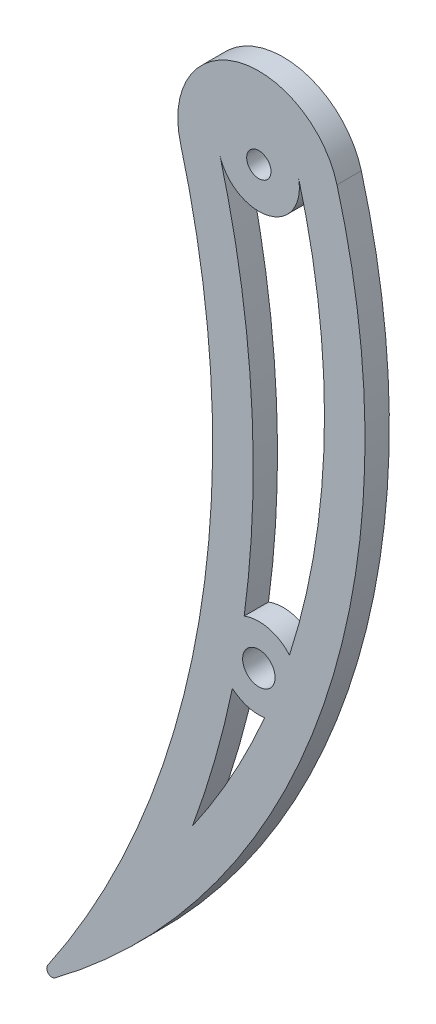
ISO-10303-21;
HEADER;
FILE_DESCRIPTION(('STEP AP214'),'2;1');
FILE_NAME('part.step','',(''),(''),'','','');
FILE_SCHEMA(('AUTOMOTIVE_DESIGN { 1 0 10303 214 1 1 1 1 }'));
ENDSEC;
DATA;
#1=APPLICATION_CONTEXT('core data for automotive mechanical design processes');
#2=APPLICATION_PROTOCOL_DEFINITION('international standard','automotive_design',2000,#1);
#3=PRODUCT_CONTEXT('',#1,'mechanical');
#4=PRODUCT('Part','Part','',(#3));
#5=PRODUCT_RELATED_PRODUCT_CATEGORY('part','',(#4));
#6=PRODUCT_DEFINITION_FORMATION('','',#4);
#7=PRODUCT_DEFINITION_CONTEXT('part definition',#1,'design');
#8=PRODUCT_DEFINITION('design','',#6,#7);
#9=PRODUCT_DEFINITION_SHAPE('','',#8);
#10=(LENGTH_UNIT() NAMED_UNIT(*) SI_UNIT(.MILLI.,.METRE.));
#11=(NAMED_UNIT(*) PLANE_ANGLE_UNIT() SI_UNIT($,.RADIAN.));
#12=(NAMED_UNIT(*) SI_UNIT($,.STERADIAN.) SOLID_ANGLE_UNIT());
#13=UNCERTAINTY_MEASURE_WITH_UNIT(LENGTH_MEASURE(1.E-05),#10,'distance_accuracy_value','');
#14=(GEOMETRIC_REPRESENTATION_CONTEXT(3) GLOBAL_UNCERTAINTY_ASSIGNED_CONTEXT((#13)) GLOBAL_UNIT_ASSIGNED_CONTEXT((#10,
#11,#12)) REPRESENTATION_CONTEXT('',''));
#15=CARTESIAN_POINT('',(0.,0.,0.));
#16=DIRECTION('',(0.,0.,1.));
#17=DIRECTION('',(1.,0.,0.));
#18=AXIS2_PLACEMENT_3D('',#15,#16,#17);
#19=CARTESIAN_POINT('',(-95.2141249078183,-217.941602281109,3.));
#20=DIRECTION('',(0.,0.,1.));
#21=DIRECTION('',(1.,0.,0.));
#22=AXIS2_PLACEMENT_3D('',#19,#20,#21);
#23=PLANE('',#22);
#24=CARTESIAN_POINT('',(-117.212595218132,15.9087079993766,3.));
#25=DIRECTION('',(0.,0.,1.));
#26=DIRECTION('',(1.,0.,0.));
#27=AXIS2_PLACEMENT_3D('',#24,#25,#26);
#28=CIRCLE('',#27,121.658432696751);
#29=CARTESIAN_POINT('',(3.33376281390273,-0.503172192800115,3.));
#30=VERTEX_POINT('',#29);
#31=CARTESIAN_POINT('',(0.314334597053286,47.3442772553386,3.));
#32=VERTEX_POINT('',#31);
#33=EDGE_CURVE('E171',#30,#32,#28,.T.);
#34=ORIENTED_EDGE('',*,*,#33,.T.);
#35=CARTESIAN_POINT('',(5.1445353159848,48.6362373997833,3.));
#36=DIRECTION('',(0.,0.,1.));
#37=DIRECTION('',(1.,0.,0.));
#38=AXIS2_PLACEMENT_3D('',#35,#36,#37);
#39=CIRCLE('',#38,5.00000000000001);
#40=CARTESIAN_POINT('',(9.96421089902344,49.9669241676822,3.));
#41=VERTEX_POINT('',#40);
#42=EDGE_CURVE('E174',#32,#41,#39,.T.);
#43=ORIENTED_EDGE('',*,*,#42,.T.);
#44=CARTESIAN_POINT('',(-77.6238192724142,25.7843353673839,3.));
#45=DIRECTION('',(0.,0.,1.));
#46=DIRECTION('',(1.,0.,0.));
#47=AXIS2_PLACEMENT_3D('',#44,#45,#46);
#48=CIRCLE('',#47,90.8650682627652);
#49=CARTESIAN_POINT('',(8.92421485570226,-1.89053444180164,3.));
#50=VERTEX_POINT('',#49);
#51=EDGE_CURVE('E160',#50,#41,#48,.T.);
#52=ORIENTED_EDGE('',*,*,#51,.F.);
#53=CARTESIAN_POINT('',(5.1445353159848,-5.16376260021669,3.));
#54=DIRECTION('',(0.,0.,1.));
#55=DIRECTION('',(1.,0.,0.));
#56=AXIS2_PLACEMENT_3D('',#53,#54,#55);
#57=CIRCLE('',#56,5.);
#58=EDGE_CURVE('E168',#50,#30,#57,.T.);
#59=ORIENTED_EDGE('',*,*,#58,.T.);
#60=EDGE_LOOP('',(#34,#43,#52,#59));
#61=FACE_BOUND('',#60,.T.);
#62=CARTESIAN_POINT('',(5.1445353159848,48.6362373997833,3.));
#63=DIRECTION('',(0.,0.,1.));
#64=DIRECTION('',(1.,0.,0.));
#65=AXIS2_PLACEMENT_3D('',#62,#63,#64);
#66=CIRCLE('',#65,1.5);
#67=CARTESIAN_POINT('',(6.6445353159848,48.6362373997833,3.));
#68=VERTEX_POINT('',#67);
#69=EDGE_CURVE('E12',#68,#68,#66,.T.);
#70=ORIENTED_EDGE('',*,*,#69,.F.);
#71=EDGE_LOOP('',(#70));
#72=FACE_BOUND('',#71,.T.);
#73=CARTESIAN_POINT('',(5.1445353159848,-5.16376260021669,3.));
#74=DIRECTION('',(0.,0.,1.));
#75=DIRECTION('',(1.,0.,0.));
#76=AXIS2_PLACEMENT_3D('',#73,#74,#75);
#77=CIRCLE('',#76,2.);
#78=CARTESIAN_POINT('',(7.1445353159848,-5.16376260021669,3.));
#79=VERTEX_POINT('',#78);
#80=EDGE_CURVE('E42',#79,#79,#77,.T.);
#81=ORIENTED_EDGE('',*,*,#80,.F.);
#82=EDGE_LOOP('',(#81));
#83=FACE_BOUND('',#82,.T.);
#84=CARTESIAN_POINT('',(5.1445353159848,48.6362373997833,3.));
#85=DIRECTION('',(0.,0.,-1.));
#86=DIRECTION('',(-1.,0.,0.));
#87=AXIS2_PLACEMENT_3D('',#84,#85,#86);
#88=CIRCLE('',#87,10.);
#89=CARTESIAN_POINT('',(-4.51586612187821,46.0523171108939,3.));
#90=VERTEX_POINT('',#89);
#91=CARTESIAN_POINT('',(14.7838864820621,51.2976109355811,3.));
#92=VERTEX_POINT('',#91);
#93=EDGE_CURVE('E184',#90,#92,#88,.T.);
#94=ORIENTED_EDGE('',*,*,#93,.F.);
#95=CARTESIAN_POINT('',(-117.212595218132,15.9087079993766,3.));
#96=DIRECTION('',(0.,0.,1.));
#97=DIRECTION('',(1.,0.,0.));
#98=AXIS2_PLACEMENT_3D('',#95,#96,#97);
#99=CIRCLE('',#98,116.658432696751);
#100=CARTESIAN_POINT('',(-20.9096081362863,-49.93143627732,3.));
#101=VERTEX_POINT('',#100);
#102=EDGE_CURVE('E206',#90,#101,#99,.F.);
#103=ORIENTED_EDGE('',*,*,#102,.T.);
#104=CARTESIAN_POINT('',(-20.373713949507,-50.2978148460824,3.));
#105=DIRECTION('',(0.,0.,-1.));
#106=DIRECTION('',(-1.,0.,0.));
#107=AXIS2_PLACEMENT_3D('',#104,#105,#106);
#108=CIRCLE('',#107,0.649165491282673);
#109=CARTESIAN_POINT('',(-19.9833926726387,-50.8165297349146,3.));
#110=VERTEX_POINT('',#109);
#111=EDGE_CURVE('E178',#110,#101,#108,.T.);
#112=ORIENTED_EDGE('',*,*,#111,.F.);
#113=CARTESIAN_POINT('',(-77.6238192724142,25.7843353673839,3.));
#114=DIRECTION('',(0.,0.,1.));
#115=DIRECTION('',(1.,0.,0.));
#116=AXIS2_PLACEMENT_3D('',#113,#114,#115);
#117=CIRCLE('',#116,95.8650682627652);
#118=EDGE_CURVE('E202',#92,#110,#117,.F.);
#119=ORIENTED_EDGE('',*,*,#118,.F.);
#120=EDGE_LOOP('',(#94,#103,#112,#119));
#121=FACE_BOUND('',#120,.T.);
#122=CARTESIAN_POINT('',(-117.212595218132,15.9087079993766,3.));
#123=DIRECTION('',(0.,0.,1.));
#124=DIRECTION('',(1.,0.,0.));
#125=AXIS2_PLACEMENT_3D('',#122,#123,#124);
#126=CIRCLE('',#125,121.658432696751);
#127=CARTESIAN_POINT('',(-3.04687813070781,-26.1265544375833,3.));
#128=VERTEX_POINT('',#127);
#129=CARTESIAN_POINT('',(1.87902252494475,-8.95010994449902,3.));
#130=VERTEX_POINT('',#129);
#131=EDGE_CURVE('E123',#128,#130,#126,.T.);
#132=ORIENTED_EDGE('',*,*,#131,.T.);
#133=CARTESIAN_POINT('',(5.1445353159848,-5.16376260021669,3.));
#134=DIRECTION('',(0.,0.,1.));
#135=DIRECTION('',(1.,0.,0.));
#136=AXIS2_PLACEMENT_3D('',#133,#134,#135);
#137=CIRCLE('',#136,5.);
#138=CARTESIAN_POINT('',(5.84942570603606,-10.1138261895066,3.));
#139=VERTEX_POINT('',#138);
#140=EDGE_CURVE('E142',#130,#139,#137,.T.);
#141=ORIENTED_EDGE('',*,*,#140,.T.);
#142=CARTESIAN_POINT('',(-77.6238192724142,25.7843353673839,3.));
#143=DIRECTION('',(0.,0.,1.));
#144=DIRECTION('',(1.,0.,0.));
#145=AXIS2_PLACEMENT_3D('',#142,#143,#144);
#146=CIRCLE('',#145,90.8650682627652);
#147=EDGE_CURVE('E138',#128,#139,#146,.T.);
#148=ORIENTED_EDGE('',*,*,#147,.F.);
#149=EDGE_LOOP('',(#132,#141,#148));
#150=FACE_BOUND('',#149,.T.);
#151=ADVANCED_FACE('F33',(#61,#72,#83,#121,#150),#23,.T.);
#152=CARTESIAN_POINT('',(-95.2141249078183,-217.941602281109,0.));
#153=DIRECTION('',(0.,0.,1.));
#154=DIRECTION('',(1.,0.,0.));
#155=AXIS2_PLACEMENT_3D('',#152,#153,#154);
#156=PLANE('',#155);
#157=CARTESIAN_POINT('',(5.1445353159848,48.6362373997833,0.));
#158=DIRECTION('',(0.,0.,-1.));
#159=DIRECTION('',(-1.,0.,0.));
#160=AXIS2_PLACEMENT_3D('',#157,#158,#159);
#161=CIRCLE('',#160,5.00000000000001);
#162=CARTESIAN_POINT('',(9.96421089902341,49.9669241676822,0.));
#163=VERTEX_POINT('',#162);
#164=CARTESIAN_POINT('',(0.314334597053286,47.3442772553386,0.));
#165=VERTEX_POINT('',#164);
#166=EDGE_CURVE('E145',#163,#165,#161,.T.);
#167=ORIENTED_EDGE('',*,*,#166,.T.);
#168=CARTESIAN_POINT('',(-117.212595218132,15.9087079993766,0.));
#169=DIRECTION('',(0.,0.,-1.));
#170=DIRECTION('',(-1.,0.,0.));
#171=AXIS2_PLACEMENT_3D('',#168,#169,#170);
#172=CIRCLE('',#171,121.658432696751);
#173=CARTESIAN_POINT('',(3.33376281390273,-0.503172192800115,0.));
#174=VERTEX_POINT('',#173);
#175=EDGE_CURVE('E154',#165,#174,#172,.T.);
#176=ORIENTED_EDGE('',*,*,#175,.T.);
#177=CARTESIAN_POINT('',(5.1445353159848,-5.16376260021669,0.));
#178=DIRECTION('',(0.,0.,-1.));
#179=DIRECTION('',(-1.,0.,0.));
#180=AXIS2_PLACEMENT_3D('',#177,#178,#179);
#181=CIRCLE('',#180,5.);
#182=CARTESIAN_POINT('',(8.92421485570225,-1.89053444180163,0.));
#183=VERTEX_POINT('',#182);
#184=EDGE_CURVE('E151',#174,#183,#181,.T.);
#185=ORIENTED_EDGE('',*,*,#184,.T.);
#186=CARTESIAN_POINT('',(-77.6238192724142,25.7843353673839,0.));
#187=DIRECTION('',(0.,0.,-1.));
#188=DIRECTION('',(-1.,0.,0.));
#189=AXIS2_PLACEMENT_3D('',#186,#187,#188);
#190=CIRCLE('',#189,90.8650682627652);
#191=EDGE_CURVE('E148',#163,#183,#190,.T.);
#192=ORIENTED_EDGE('',*,*,#191,.F.);
#193=EDGE_LOOP('',(#167,#176,#185,#192));
#194=FACE_BOUND('',#193,.T.);
#195=CARTESIAN_POINT('',(5.1445353159848,48.6362373997833,0.));
#196=DIRECTION('',(0.,0.,1.));
#197=DIRECTION('',(1.,0.,0.));
#198=AXIS2_PLACEMENT_3D('',#195,#196,#197);
#199=CIRCLE('',#198,1.5);
#200=CARTESIAN_POINT('',(6.6445353159848,48.6362373997833,0.));
#201=VERTEX_POINT('',#200);
#202=EDGE_CURVE('E37',#201,#201,#199,.T.);
#203=ORIENTED_EDGE('',*,*,#202,.T.);
#204=EDGE_LOOP('',(#203));
#205=FACE_BOUND('',#204,.T.);
#206=CARTESIAN_POINT('',(5.1445353159848,-5.16376260021669,0.));
#207=DIRECTION('',(0.,0.,1.));
#208=DIRECTION('',(1.,0.,0.));
#209=AXIS2_PLACEMENT_3D('',#206,#207,#208);
#210=CIRCLE('',#209,2.);
#211=CARTESIAN_POINT('',(7.1445353159848,-5.16376260021669,0.));
#212=VERTEX_POINT('',#211);
#213=EDGE_CURVE('E209',#212,#212,#210,.T.);
#214=ORIENTED_EDGE('',*,*,#213,.T.);
#215=EDGE_LOOP('',(#214));
#216=FACE_BOUND('',#215,.T.);
#217=CARTESIAN_POINT('',(-117.212595218132,15.9087079993766,0.));
#218=DIRECTION('',(0.,0.,-1.));
#219=DIRECTION('',(-1.,0.,0.));
#220=AXIS2_PLACEMENT_3D('',#217,#218,#219);
#221=CIRCLE('',#220,116.658432696751);
#222=CARTESIAN_POINT('',(-20.9096081362863,-49.93143627732,0.));
#223=VERTEX_POINT('',#222);
#224=CARTESIAN_POINT('',(-4.51586612187821,46.0523171108939,0.));
#225=VERTEX_POINT('',#224);
#226=EDGE_CURVE('E193',#223,#225,#221,.F.);
#227=ORIENTED_EDGE('',*,*,#226,.T.);
#228=CARTESIAN_POINT('',(5.1445353159848,48.6362373997833,0.));
#229=DIRECTION('',(0.,0.,-1.));
#230=DIRECTION('',(-1.,0.,0.));
#231=AXIS2_PLACEMENT_3D('',#228,#229,#230);
#232=CIRCLE('',#231,10.);
#233=CARTESIAN_POINT('',(14.7838864820621,51.2976109355811,0.));
#234=VERTEX_POINT('',#233);
#235=EDGE_CURVE('E181',#225,#234,#232,.T.);
#236=ORIENTED_EDGE('',*,*,#235,.T.);
#237=CARTESIAN_POINT('',(-77.6238192724142,25.7843353673839,0.));
#238=DIRECTION('',(0.,0.,-1.));
#239=DIRECTION('',(-1.,0.,0.));
#240=AXIS2_PLACEMENT_3D('',#237,#238,#239);
#241=CIRCLE('',#240,95.8650682627652);
#242=CARTESIAN_POINT('',(-19.9833926726388,-50.8165297349146,0.));
#243=VERTEX_POINT('',#242);
#244=EDGE_CURVE('E197',#243,#234,#241,.F.);
#245=ORIENTED_EDGE('',*,*,#244,.F.);
#246=CARTESIAN_POINT('',(-20.373713949507,-50.2978148460824,0.));
#247=DIRECTION('',(0.,0.,-1.));
#248=DIRECTION('',(-1.,0.,0.));
#249=AXIS2_PLACEMENT_3D('',#246,#247,#248);
#250=CIRCLE('',#249,0.649165491282673);
#251=EDGE_CURVE('E177',#243,#223,#250,.T.);
#252=ORIENTED_EDGE('',*,*,#251,.T.);
#253=EDGE_LOOP('',(#227,#236,#245,#252));
#254=FACE_BOUND('',#253,.T.);
#255=CARTESIAN_POINT('',(5.1445353159848,-5.16376260021669,0.));
#256=DIRECTION('',(0.,0.,-1.));
#257=DIRECTION('',(-1.,0.,0.));
#258=AXIS2_PLACEMENT_3D('',#255,#256,#257);
#259=CIRCLE('',#258,5.);
#260=CARTESIAN_POINT('',(5.84942570603607,-10.1138261895066,0.));
#261=VERTEX_POINT('',#260);
#262=CARTESIAN_POINT('',(1.87902252494475,-8.95010994449902,0.));
#263=VERTEX_POINT('',#262);
#264=EDGE_CURVE('E58',#261,#263,#259,.T.);
#265=ORIENTED_EDGE('',*,*,#264,.T.);
#266=CARTESIAN_POINT('',(-117.212595218132,15.9087079993766,0.));
#267=DIRECTION('',(0.,0.,-1.));
#268=DIRECTION('',(-1.,0.,0.));
#269=AXIS2_PLACEMENT_3D('',#266,#267,#268);
#270=CIRCLE('',#269,121.658432696751);
#271=CARTESIAN_POINT('',(-3.04687813070782,-26.1265544375832,0.));
#272=VERTEX_POINT('',#271);
#273=EDGE_CURVE('E121',#263,#272,#270,.T.);
#274=ORIENTED_EDGE('',*,*,#273,.T.);
#275=CARTESIAN_POINT('',(-77.6238192724142,25.7843353673839,0.));
#276=DIRECTION('',(0.,0.,-1.));
#277=DIRECTION('',(-1.,0.,0.));
#278=AXIS2_PLACEMENT_3D('',#275,#276,#277);
#279=CIRCLE('',#278,90.8650682627652);
#280=EDGE_CURVE('E129',#261,#272,#279,.T.);
#281=ORIENTED_EDGE('',*,*,#280,.F.);
#282=EDGE_LOOP('',(#265,#274,#281));
#283=FACE_BOUND('',#282,.T.);
#284=ADVANCED_FACE('F133',(#194,#205,#216,#254,#283),#156,.F.);
#285=CARTESIAN_POINT('',(5.1445353159848,-5.16376260021669,3.));
#286=DIRECTION('',(0.,0.,-1.));
#287=DIRECTION('',(-1.,0.,0.));
#288=AXIS2_PLACEMENT_3D('',#285,#286,#287);
#289=CYLINDRICAL_SURFACE('',#288,2.);
#290=ORIENTED_EDGE('',*,*,#80,.T.);
#291=EDGE_LOOP('',(#290));
#292=FACE_BOUND('',#291,.T.);
#293=ORIENTED_EDGE('',*,*,#213,.F.);
#294=EDGE_LOOP('',(#293));
#295=FACE_BOUND('',#294,.T.);
#296=ADVANCED_FACE('F35',(#292,#295),#289,.F.);
#297=CARTESIAN_POINT('',(5.1445353159848,48.6362373997833,3.));
#298=DIRECTION('',(0.,0.,-1.));
#299=DIRECTION('',(-1.,0.,0.));
#300=AXIS2_PLACEMENT_3D('',#297,#298,#299);
#301=CYLINDRICAL_SURFACE('',#300,1.5);
#302=ORIENTED_EDGE('',*,*,#69,.T.);
#303=EDGE_LOOP('',(#302));
#304=FACE_BOUND('',#303,.T.);
#305=ORIENTED_EDGE('',*,*,#202,.F.);
#306=EDGE_LOOP('',(#305));
#307=FACE_BOUND('',#306,.T.);
#308=ADVANCED_FACE('F218',(#304,#307),#301,.F.);
#309=CARTESIAN_POINT('',(-77.6238192724142,25.7843353673839,10.));
#310=DIRECTION('',(0.,0.,-1.));
#311=DIRECTION('',(-1.,0.,0.));
#312=AXIS2_PLACEMENT_3D('',#309,#310,#311);
#313=CYLINDRICAL_SURFACE('',#312,95.8650682627652);
#314=ORIENTED_EDGE('',*,*,#118,.T.);
#315=DIRECTION('',(0.,0.,-1.));
#316=VECTOR('',#315,1.);
#317=CARTESIAN_POINT('',(-19.9833926726387,-50.8165297349146,10.));
#318=LINE('',#317,#316);
#319=EDGE_CURVE('E200',#110,#243,#318,.T.);
#320=ORIENTED_EDGE('',*,*,#319,.T.);
#321=ORIENTED_EDGE('',*,*,#244,.T.);
#322=DIRECTION('',(0.,0.,-1.));
#323=VECTOR('',#322,1.);
#324=CARTESIAN_POINT('',(14.7838864820621,51.2976109355811,3.));
#325=LINE('',#324,#323);
#326=EDGE_CURVE('E190',#92,#234,#325,.T.);
#327=ORIENTED_EDGE('',*,*,#326,.F.);
#328=EDGE_LOOP('',(#314,#320,#321,#327));
#329=FACE_BOUND('',#328,.T.);
#330=ADVANCED_FACE('F220',(#329),#313,.T.);
#331=CARTESIAN_POINT('',(-117.212595218132,15.9087079993766,10.));
#332=DIRECTION('',(0.,0.,-1.));
#333=DIRECTION('',(-1.,0.,0.));
#334=AXIS2_PLACEMENT_3D('',#331,#332,#333);
#335=CYLINDRICAL_SURFACE('',#334,116.658432696751);
#336=ORIENTED_EDGE('',*,*,#102,.F.);
#337=DIRECTION('',(0.,0.,-1.));
#338=VECTOR('',#337,1.);
#339=CARTESIAN_POINT('',(-4.51586612187821,46.0523171108939,3.));
#340=LINE('',#339,#338);
#341=EDGE_CURVE('E187',#90,#225,#340,.T.);
#342=ORIENTED_EDGE('',*,*,#341,.T.);
#343=ORIENTED_EDGE('',*,*,#226,.F.);
#344=DIRECTION('',(0.,0.,-1.));
#345=VECTOR('',#344,1.);
#346=CARTESIAN_POINT('',(-20.9096081362863,-49.93143627732,10.));
#347=LINE('',#346,#345);
#348=EDGE_CURVE('E199',#101,#223,#347,.T.);
#349=ORIENTED_EDGE('',*,*,#348,.F.);
#350=EDGE_LOOP('',(#336,#342,#343,#349));
#351=FACE_BOUND('',#350,.T.);
#352=ADVANCED_FACE('F226',(#351),#335,.F.);
#353=CARTESIAN_POINT('',(5.1445353159848,48.6362373997833,3.));
#354=DIRECTION('',(0.,0.,-1.));
#355=DIRECTION('',(-1.,0.,0.));
#356=AXIS2_PLACEMENT_3D('',#353,#354,#355);
#357=CYLINDRICAL_SURFACE('',#356,10.);
#358=ORIENTED_EDGE('',*,*,#235,.F.);
#359=ORIENTED_EDGE('',*,*,#341,.F.);
#360=ORIENTED_EDGE('',*,*,#93,.T.);
#361=ORIENTED_EDGE('',*,*,#326,.T.);
#362=EDGE_LOOP('',(#358,#359,#360,#361));
#363=FACE_BOUND('',#362,.T.);
#364=ADVANCED_FACE('F241',(#363),#357,.T.);
#365=CARTESIAN_POINT('',(-20.373713949507,-50.2978148460824,3.));
#366=DIRECTION('',(0.,0.,-1.));
#367=DIRECTION('',(-1.,0.,0.));
#368=AXIS2_PLACEMENT_3D('',#365,#366,#367);
#369=CYLINDRICAL_SURFACE('',#368,0.649165491282673);
#370=ORIENTED_EDGE('',*,*,#251,.F.);
#371=ORIENTED_EDGE('',*,*,#319,.F.);
#372=ORIENTED_EDGE('',*,*,#111,.T.);
#373=ORIENTED_EDGE('',*,*,#348,.T.);
#374=EDGE_LOOP('',(#370,#371,#372,#373));
#375=FACE_BOUND('',#374,.T.);
#376=ADVANCED_FACE('F246',(#375),#369,.T.);
#377=CARTESIAN_POINT('',(5.1445353159848,48.6362373997833,5.));
#378=DIRECTION('',(0.,0.,-1.));
#379=DIRECTION('',(-1.,0.,0.));
#380=AXIS2_PLACEMENT_3D('',#377,#378,#379);
#381=CYLINDRICAL_SURFACE('',#380,5.00000000000001);
#382=DIRECTION('',(0.,0.,-1.));
#383=VECTOR('',#382,1.);
#384=CARTESIAN_POINT('',(0.314334597053286,47.3442772553386,5.));
#385=LINE('',#384,#383);
#386=EDGE_CURVE('E158',#32,#165,#385,.T.);
#387=ORIENTED_EDGE('',*,*,#386,.T.);
#388=ORIENTED_EDGE('',*,*,#166,.F.);
#389=DIRECTION('',(0.,0.,-1.));
#390=VECTOR('',#389,1.);
#391=CARTESIAN_POINT('',(9.96421089902344,49.9669241676822,5.));
#392=LINE('',#391,#390);
#393=EDGE_CURVE('E157',#41,#163,#392,.T.);
#394=ORIENTED_EDGE('',*,*,#393,.F.);
#395=ORIENTED_EDGE('',*,*,#42,.F.);
#396=EDGE_LOOP('',(#387,#388,#394,#395));
#397=FACE_BOUND('',#396,.T.);
#398=ADVANCED_FACE('F250',(#397),#381,.T.);
#399=CARTESIAN_POINT('',(-117.212595218132,15.9087079993766,5.));
#400=DIRECTION('',(0.,0.,-1.));
#401=DIRECTION('',(-1.,0.,0.));
#402=AXIS2_PLACEMENT_3D('',#399,#400,#401);
#403=CYLINDRICAL_SURFACE('',#402,121.658432696751);
#404=DIRECTION('',(0.,0.,-1.));
#405=VECTOR('',#404,1.);
#406=CARTESIAN_POINT('',(3.33376281390273,-0.503172192800115,5.));
#407=LINE('',#406,#405);
#408=EDGE_CURVE('E161',#30,#174,#407,.T.);
#409=ORIENTED_EDGE('',*,*,#408,.T.);
#410=ORIENTED_EDGE('',*,*,#175,.F.);
#411=ORIENTED_EDGE('',*,*,#386,.F.);
#412=ORIENTED_EDGE('',*,*,#33,.F.);
#413=EDGE_LOOP('',(#409,#410,#411,#412));
#414=FACE_BOUND('',#413,.T.);
#415=ADVANCED_FACE('F254',(#414),#403,.T.);
#416=CARTESIAN_POINT('',(5.1445353159848,-5.16376260021669,5.));
#417=DIRECTION('',(0.,0.,-1.));
#418=DIRECTION('',(-1.,0.,0.));
#419=AXIS2_PLACEMENT_3D('',#416,#417,#418);
#420=CYLINDRICAL_SURFACE('',#419,5.);
#421=DIRECTION('',(0.,0.,-1.));
#422=VECTOR('',#421,1.);
#423=CARTESIAN_POINT('',(8.92421485570225,-1.89053444180163,5.));
#424=LINE('',#423,#422);
#425=EDGE_CURVE('E163',#50,#183,#424,.T.);
#426=ORIENTED_EDGE('',*,*,#425,.T.);
#427=ORIENTED_EDGE('',*,*,#184,.F.);
#428=ORIENTED_EDGE('',*,*,#408,.F.);
#429=ORIENTED_EDGE('',*,*,#58,.F.);
#430=EDGE_LOOP('',(#426,#427,#428,#429));
#431=FACE_BOUND('',#430,.T.);
#432=ADVANCED_FACE('F260',(#431),#420,.T.);
#433=CARTESIAN_POINT('',(-77.6238192724142,25.7843353673839,5.));
#434=DIRECTION('',(0.,0.,-1.));
#435=DIRECTION('',(-1.,0.,0.));
#436=AXIS2_PLACEMENT_3D('',#433,#434,#435);
#437=CYLINDRICAL_SURFACE('',#436,90.8650682627652);
#438=ORIENTED_EDGE('',*,*,#51,.T.);
#439=ORIENTED_EDGE('',*,*,#393,.T.);
#440=ORIENTED_EDGE('',*,*,#191,.T.);
#441=ORIENTED_EDGE('',*,*,#425,.F.);
#442=EDGE_LOOP('',(#438,#439,#440,#441));
#443=FACE_BOUND('',#442,.T.);
#444=ADVANCED_FACE('F256',(#443),#437,.F.);
#445=CARTESIAN_POINT('',(5.1445353159848,-5.16376260021669,5.));
#446=DIRECTION('',(0.,0.,-1.));
#447=DIRECTION('',(-1.,0.,0.));
#448=AXIS2_PLACEMENT_3D('',#445,#446,#447);
#449=CYLINDRICAL_SURFACE('',#448,5.);
#450=DIRECTION('',(0.,0.,-1.));
#451=VECTOR('',#450,1.);
#452=CARTESIAN_POINT('',(1.87902252494475,-8.95010994449902,5.));
#453=LINE('',#452,#451);
#454=EDGE_CURVE('E125',#130,#263,#453,.T.);
#455=ORIENTED_EDGE('',*,*,#454,.T.);
#456=ORIENTED_EDGE('',*,*,#264,.F.);
#457=DIRECTION('',(0.,0.,-1.));
#458=VECTOR('',#457,1.);
#459=CARTESIAN_POINT('',(5.84942570603606,-10.1138261895066,5.));
#460=LINE('',#459,#458);
#461=EDGE_CURVE('E126',#139,#261,#460,.T.);
#462=ORIENTED_EDGE('',*,*,#461,.F.);
#463=ORIENTED_EDGE('',*,*,#140,.F.);
#464=EDGE_LOOP('',(#455,#456,#462,#463));
#465=FACE_BOUND('',#464,.T.);
#466=ADVANCED_FACE('F259',(#465),#449,.T.);
#467=CARTESIAN_POINT('',(-117.212595218132,15.9087079993766,5.));
#468=DIRECTION('',(0.,0.,-1.));
#469=DIRECTION('',(-1.,0.,0.));
#470=AXIS2_PLACEMENT_3D('',#467,#468,#469);
#471=CYLINDRICAL_SURFACE('',#470,121.658432696751);
#472=DIRECTION('',(0.,0.,-1.));
#473=VECTOR('',#472,1.);
#474=CARTESIAN_POINT('',(-3.04687813070782,-26.1265544375832,5.));
#475=LINE('',#474,#473);
#476=EDGE_CURVE('E50',#128,#272,#475,.T.);
#477=ORIENTED_EDGE('',*,*,#476,.T.);
#478=ORIENTED_EDGE('',*,*,#273,.F.);
#479=ORIENTED_EDGE('',*,*,#454,.F.);
#480=ORIENTED_EDGE('',*,*,#131,.F.);
#481=EDGE_LOOP('',(#477,#478,#479,#480));
#482=FACE_BOUND('',#481,.T.);
#483=ADVANCED_FACE('F118',(#482),#471,.T.);
#484=CARTESIAN_POINT('',(-77.6238192724142,25.7843353673839,5.));
#485=DIRECTION('',(0.,0.,-1.));
#486=DIRECTION('',(-1.,0.,0.));
#487=AXIS2_PLACEMENT_3D('',#484,#485,#486);
#488=CYLINDRICAL_SURFACE('',#487,90.8650682627652);
#489=ORIENTED_EDGE('',*,*,#147,.T.);
#490=ORIENTED_EDGE('',*,*,#461,.T.);
#491=ORIENTED_EDGE('',*,*,#280,.T.);
#492=ORIENTED_EDGE('',*,*,#476,.F.);
#493=EDGE_LOOP('',(#489,#490,#491,#492));
#494=FACE_BOUND('',#493,.T.);
#495=ADVANCED_FACE('F130',(#494),#488,.F.);
#496=CLOSED_SHELL('',(#151,#284,#296,#308,#330,#352,#364,#376,#398,#415,#432,#444,#466,#483,#495));
#497=MANIFOLD_SOLID_BREP('B2',#496);
#498=ADVANCED_BREP_SHAPE_REPRESENTATION('',(#18,#497),#14);
#499=SHAPE_DEFINITION_REPRESENTATION(#9,#498);
ENDSEC;
END-ISO-10303-21;
